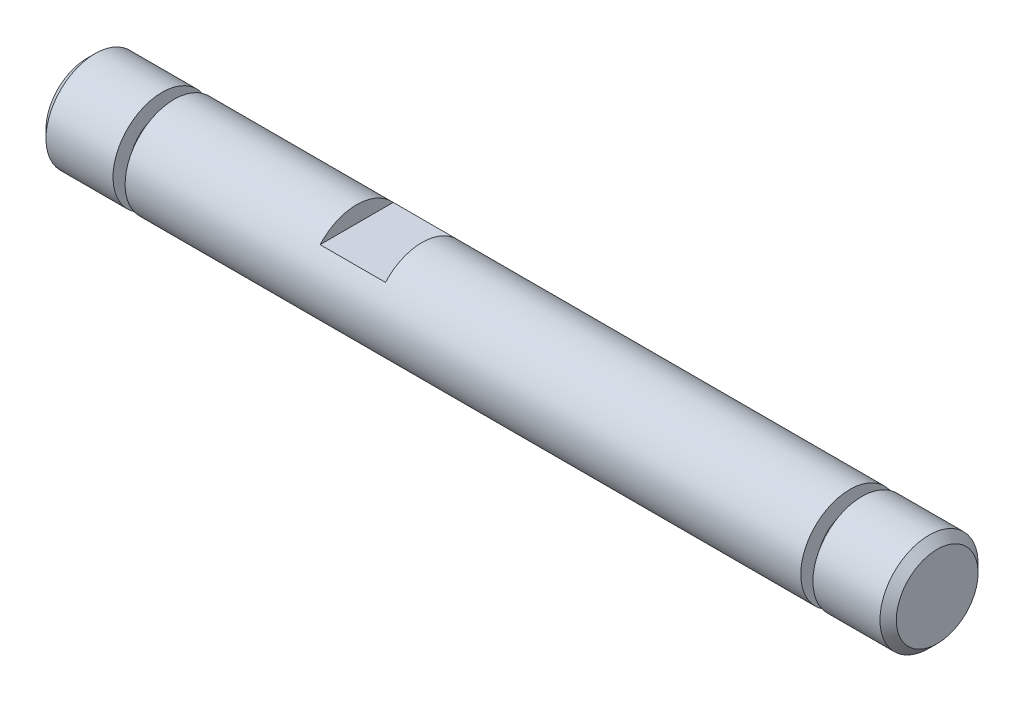
ISO-10303-21;
HEADER;
FILE_DESCRIPTION(('STEP AP214'),'2;1');
FILE_NAME('part.step','',(''),(''),'','','');
FILE_SCHEMA(('AUTOMOTIVE_DESIGN { 1 0 10303 214 1 1 1 1 }'));
ENDSEC;
DATA;
#1=APPLICATION_CONTEXT('core data for automotive mechanical design processes');
#2=APPLICATION_PROTOCOL_DEFINITION('international standard','automotive_design',2000,#1);
#3=PRODUCT_CONTEXT('',#1,'mechanical');
#4=PRODUCT('Part','Part','',(#3));
#5=PRODUCT_RELATED_PRODUCT_CATEGORY('part','',(#4));
#6=PRODUCT_DEFINITION_FORMATION('','',#4);
#7=PRODUCT_DEFINITION_CONTEXT('part definition',#1,'design');
#8=PRODUCT_DEFINITION('design','',#6,#7);
#9=PRODUCT_DEFINITION_SHAPE('','',#8);
#10=(LENGTH_UNIT() NAMED_UNIT(*) SI_UNIT(.MILLI.,.METRE.));
#11=(NAMED_UNIT(*) PLANE_ANGLE_UNIT() SI_UNIT($,.RADIAN.));
#12=(NAMED_UNIT(*) SI_UNIT($,.STERADIAN.) SOLID_ANGLE_UNIT());
#13=UNCERTAINTY_MEASURE_WITH_UNIT(LENGTH_MEASURE(1.E-05),#10,'distance_accuracy_value','');
#14=(GEOMETRIC_REPRESENTATION_CONTEXT(3) GLOBAL_UNCERTAINTY_ASSIGNED_CONTEXT((#13)) GLOBAL_UNIT_ASSIGNED_CONTEXT((#10,
#11,#12)) REPRESENTATION_CONTEXT('',''));
#15=CARTESIAN_POINT('',(0.,0.,0.));
#16=DIRECTION('',(0.,0.,1.));
#17=DIRECTION('',(1.,0.,0.));
#18=AXIS2_PLACEMENT_3D('',#15,#16,#17);
#19=CARTESIAN_POINT('',(0.,0.,0.));
#20=DIRECTION('',(-1.,0.,0.));
#21=DIRECTION('',(0.,0.,1.));
#22=AXIS2_PLACEMENT_3D('',#19,#20,#21);
#23=CYLINDRICAL_SURFACE('',#22,3.);
#24=CARTESIAN_POINT('',(20.66,0.,0.));
#25=DIRECTION('',(1.,0.,0.));
#26=DIRECTION('',(0.,1.,0.));
#27=AXIS2_PLACEMENT_3D('',#24,#25,#26);
#28=CIRCLE('',#27,3.);
#29=CARTESIAN_POINT('',(20.66,3.,0.));
#30=VERTEX_POINT('',#29);
#31=EDGE_CURVE('E98',#30,#30,#28,.T.);
#32=ORIENTED_EDGE('',*,*,#31,.F.);
#33=EDGE_LOOP('',(#32));
#34=FACE_BOUND('',#33,.T.);
#35=CARTESIAN_POINT('',(-5.49999999999999,0.,0.));
#36=DIRECTION('',(-1.,0.,0.));
#37=DIRECTION('',(0.,-1.,0.));
#38=AXIS2_PLACEMENT_3D('',#35,#36,#37);
#39=CIRCLE('',#38,3.);
#40=CARTESIAN_POINT('',(-5.5,2.00000000000001,2.23606797749978));
#41=VERTEX_POINT('',#40);
#42=CARTESIAN_POINT('',(-5.5,2.00000000000001,-2.23606797749978));
#43=VERTEX_POINT('',#42);
#44=EDGE_CURVE('E65',#41,#43,#39,.T.);
#45=ORIENTED_EDGE('',*,*,#44,.F.);
#46=DIRECTION('',(-1.,0.,0.));
#47=VECTOR('',#46,1.);
#48=CARTESIAN_POINT('',(0.,2.00000000000001,2.23606797749978));
#49=LINE('',#48,#47);
#50=CARTESIAN_POINT('',(-9.5,2.00000000000001,2.23606797749978));
#51=VERTEX_POINT('',#50);
#52=EDGE_CURVE('E11',#41,#51,#49,.T.);
#53=ORIENTED_EDGE('',*,*,#52,.T.);
#54=CARTESIAN_POINT('',(-9.5,0.,0.));
#55=DIRECTION('',(-1.,0.,0.));
#56=DIRECTION('',(0.,0.,1.));
#57=AXIS2_PLACEMENT_3D('',#54,#55,#56);
#58=CIRCLE('',#57,3.);
#59=CARTESIAN_POINT('',(-9.5,2.00000000000001,-2.23606797749978));
#60=VERTEX_POINT('',#59);
#61=EDGE_CURVE('E41',#51,#60,#58,.T.);
#62=ORIENTED_EDGE('',*,*,#61,.T.);
#63=DIRECTION('',(-1.,0.,0.));
#64=VECTOR('',#63,1.);
#65=CARTESIAN_POINT('',(0.,2.00000000000001,-2.23606797749978));
#66=LINE('',#65,#64);
#67=EDGE_CURVE('E70',#60,#43,#66,.F.);
#68=ORIENTED_EDGE('',*,*,#67,.T.);
#69=EDGE_LOOP('',(#45,#53,#62,#68));
#70=FACE_BOUND('',#69,.T.);
#71=CARTESIAN_POINT('',(-20.66,0.,0.));
#72=DIRECTION('',(1.,0.,0.));
#73=DIRECTION('',(0.,1.,0.));
#74=AXIS2_PLACEMENT_3D('',#71,#72,#73);
#75=CIRCLE('',#74,3.);
#76=CARTESIAN_POINT('',(-20.66,3.,0.));
#77=VERTEX_POINT('',#76);
#78=EDGE_CURVE('E92',#77,#77,#75,.T.);
#79=ORIENTED_EDGE('',*,*,#78,.T.);
#80=EDGE_LOOP('',(#79));
#81=FACE_BOUND('',#80,.T.);
#82=ADVANCED_FACE('F33',(#34,#70,#81),#23,.T.);
#83=CARTESIAN_POINT('',(-21.4,0.,0.));
#84=DIRECTION('',(1.,0.,0.));
#85=DIRECTION('',(0.,1.,0.));
#86=AXIS2_PLACEMENT_3D('',#83,#84,#85);
#87=CIRCLE('',#86,3.);
#88=CARTESIAN_POINT('',(-21.4,3.,0.));
#89=VERTEX_POINT('',#88);
#90=EDGE_CURVE('E95',#89,#89,#87,.T.);
#91=ORIENTED_EDGE('',*,*,#90,.F.);
#92=EDGE_LOOP('',(#91));
#93=FACE_BOUND('',#92,.T.);
#94=CARTESIAN_POINT('',(-25.5,0.,0.));
#95=DIRECTION('',(1.,0.,0.));
#96=DIRECTION('',(0.,0.,-1.));
#97=AXIS2_PLACEMENT_3D('',#94,#95,#96);
#98=CIRCLE('',#97,3.);
#99=CARTESIAN_POINT('',(-25.5,0.,-3.));
#100=VERTEX_POINT('',#99);
#101=EDGE_CURVE('E77',#100,#100,#98,.T.);
#102=ORIENTED_EDGE('',*,*,#101,.T.);
#103=EDGE_LOOP('',(#102));
#104=FACE_BOUND('',#103,.T.);
#105=ADVANCED_FACE('F134',(#93,#104),#23,.T.);
#106=CARTESIAN_POINT('',(-26.,0.,0.));
#107=DIRECTION('',(1.,0.,0.));
#108=DIRECTION('',(0.,0.,-1.));
#109=AXIS2_PLACEMENT_3D('',#106,#107,#108);
#110=PLANE('',#109);
#111=CARTESIAN_POINT('',(-26.,0.,0.));
#112=DIRECTION('',(1.,0.,0.));
#113=DIRECTION('',(0.,0.,-1.));
#114=AXIS2_PLACEMENT_3D('',#111,#112,#113);
#115=CIRCLE('',#114,2.49999999999999);
#116=CARTESIAN_POINT('',(-26.,0.,-2.49999999999999));
#117=VERTEX_POINT('',#116);
#118=EDGE_CURVE('E67',#117,#117,#115,.F.);
#119=ORIENTED_EDGE('',*,*,#118,.T.);
#120=EDGE_LOOP('',(#119));
#121=FACE_BOUND('',#120,.T.);
#122=ADVANCED_FACE('F139',(#121),#110,.F.);
#123=CARTESIAN_POINT('',(-26.,0.,0.));
#124=DIRECTION('',(1.,0.,0.));
#125=DIRECTION('',(0.,0.,-1.));
#126=AXIS2_PLACEMENT_3D('',#123,#124,#125);
#127=CONICAL_SURFACE('',#126,2.49999999999999,0.785398163397446);
#128=ORIENTED_EDGE('',*,*,#101,.F.);
#129=EDGE_LOOP('',(#128));
#130=FACE_BOUND('',#129,.T.);
#131=ORIENTED_EDGE('',*,*,#118,.F.);
#132=EDGE_LOOP('',(#131));
#133=FACE_BOUND('',#132,.T.);
#134=ADVANCED_FACE('F170',(#130,#133),#127,.T.);
#135=CARTESIAN_POINT('',(-21.4,3.,0.));
#136=DIRECTION('',(-1.,0.,0.));
#137=DIRECTION('',(0.,-1.,0.));
#138=AXIS2_PLACEMENT_3D('',#135,#136,#137);
#139=PLANE('',#138);
#140=CARTESIAN_POINT('',(-21.4,0.,0.));
#141=DIRECTION('',(1.,0.,0.));
#142=DIRECTION('',(0.,1.,0.));
#143=AXIS2_PLACEMENT_3D('',#140,#141,#142);
#144=CIRCLE('',#143,2.);
#145=CARTESIAN_POINT('',(-21.4,2.,0.));
#146=VERTEX_POINT('',#145);
#147=EDGE_CURVE('E85',#146,#146,#144,.T.);
#148=ORIENTED_EDGE('',*,*,#147,.F.);
#149=EDGE_LOOP('',(#148));
#150=FACE_BOUND('',#149,.T.);
#151=ORIENTED_EDGE('',*,*,#90,.T.);
#152=EDGE_LOOP('',(#151));
#153=FACE_BOUND('',#152,.T.);
#154=ADVANCED_FACE('F166',(#150,#153),#139,.F.);
#155=CARTESIAN_POINT('',(0.,0.,0.));
#156=DIRECTION('',(1.,0.,0.));
#157=DIRECTION('',(0.,1.,0.));
#158=AXIS2_PLACEMENT_3D('',#155,#156,#157);
#159=CYLINDRICAL_SURFACE('',#158,2.);
#160=CARTESIAN_POINT('',(-20.66,0.,0.));
#161=DIRECTION('',(1.,0.,0.));
#162=DIRECTION('',(0.,1.,0.));
#163=AXIS2_PLACEMENT_3D('',#160,#161,#162);
#164=CIRCLE('',#163,2.);
#165=CARTESIAN_POINT('',(-20.66,2.,0.));
#166=VERTEX_POINT('',#165);
#167=EDGE_CURVE('E89',#166,#166,#164,.T.);
#168=ORIENTED_EDGE('',*,*,#167,.F.);
#169=EDGE_LOOP('',(#168));
#170=FACE_BOUND('',#169,.T.);
#171=ORIENTED_EDGE('',*,*,#147,.T.);
#172=EDGE_LOOP('',(#171));
#173=FACE_BOUND('',#172,.T.);
#174=ADVANCED_FACE('F169',(#170,#173),#159,.T.);
#175=CARTESIAN_POINT('',(-20.66,3.,0.));
#176=DIRECTION('',(1.,0.,0.));
#177=DIRECTION('',(0.,1.,0.));
#178=AXIS2_PLACEMENT_3D('',#175,#176,#177);
#179=PLANE('',#178);
#180=ORIENTED_EDGE('',*,*,#78,.F.);
#181=EDGE_LOOP('',(#180));
#182=FACE_BOUND('',#181,.T.);
#183=ORIENTED_EDGE('',*,*,#167,.T.);
#184=EDGE_LOOP('',(#183));
#185=FACE_BOUND('',#184,.T.);
#186=ADVANCED_FACE('F161',(#182,#185),#179,.F.);
#187=CARTESIAN_POINT('',(-9.5,4.00000000000001,-3.));
#188=DIRECTION('',(-1.,0.,0.));
#189=DIRECTION('',(0.,0.,1.));
#190=AXIS2_PLACEMENT_3D('',#187,#188,#189);
#191=PLANE('',#190);
#192=DIRECTION('',(0.,0.,1.));
#193=VECTOR('',#192,1.);
#194=CARTESIAN_POINT('',(-9.5,2.00000000000001,-3.));
#195=LINE('',#194,#193);
#196=EDGE_CURVE('E60',#60,#51,#195,.T.);
#197=ORIENTED_EDGE('',*,*,#196,.F.);
#198=ORIENTED_EDGE('',*,*,#61,.F.);
#199=EDGE_LOOP('',(#197,#198));
#200=FACE_BOUND('',#199,.T.);
#201=ADVANCED_FACE('F158',(#200),#191,.F.);
#202=CARTESIAN_POINT('',(-9.5,2.00000000000001,-3.));
#203=DIRECTION('',(0.,-1.,0.));
#204=DIRECTION('',(0.,0.,-1.));
#205=AXIS2_PLACEMENT_3D('',#202,#203,#204);
#206=PLANE('',#205);
#207=DIRECTION('',(0.,0.,1.));
#208=VECTOR('',#207,1.);
#209=CARTESIAN_POINT('',(-5.5,2.00000000000001,-3.));
#210=LINE('',#209,#208);
#211=EDGE_CURVE('E48',#43,#41,#210,.T.);
#212=ORIENTED_EDGE('',*,*,#211,.F.);
#213=ORIENTED_EDGE('',*,*,#67,.F.);
#214=ORIENTED_EDGE('',*,*,#196,.T.);
#215=ORIENTED_EDGE('',*,*,#52,.F.);
#216=EDGE_LOOP('',(#212,#213,#214,#215));
#217=FACE_BOUND('',#216,.T.);
#218=ADVANCED_FACE('F59',(#217),#206,.F.);
#219=CARTESIAN_POINT('',(-5.5,4.00000000000001,-3.));
#220=DIRECTION('',(-1.,0.,0.));
#221=DIRECTION('',(0.,-1.,0.));
#222=AXIS2_PLACEMENT_3D('',#219,#220,#221);
#223=PLANE('',#222);
#224=ORIENTED_EDGE('',*,*,#44,.T.);
#225=ORIENTED_EDGE('',*,*,#211,.T.);
#226=EDGE_LOOP('',(#224,#225));
#227=FACE_BOUND('',#226,.T.);
#228=ADVANCED_FACE('F64',(#227),#223,.T.);
#229=CARTESIAN_POINT('',(20.66,3.,0.));
#230=DIRECTION('',(-1.,0.,0.));
#231=DIRECTION('',(0.,-1.,0.));
#232=AXIS2_PLACEMENT_3D('',#229,#230,#231);
#233=PLANE('',#232);
#234=CARTESIAN_POINT('',(20.66,0.,0.));
#235=DIRECTION('',(1.,0.,0.));
#236=DIRECTION('',(0.,1.,0.));
#237=AXIS2_PLACEMENT_3D('',#234,#235,#236);
#238=CIRCLE('',#237,1.99999999999999);
#239=CARTESIAN_POINT('',(20.66,2.,0.));
#240=VERTEX_POINT('',#239);
#241=EDGE_CURVE('E101',#240,#240,#238,.T.);
#242=ORIENTED_EDGE('',*,*,#241,.F.);
#243=EDGE_LOOP('',(#242));
#244=FACE_BOUND('',#243,.T.);
#245=ORIENTED_EDGE('',*,*,#31,.T.);
#246=EDGE_LOOP('',(#245));
#247=FACE_BOUND('',#246,.T.);
#248=ADVANCED_FACE('F124',(#244,#247),#233,.F.);
#249=CARTESIAN_POINT('',(0.,0.,0.));
#250=DIRECTION('',(1.,0.,0.));
#251=DIRECTION('',(0.,1.,0.));
#252=AXIS2_PLACEMENT_3D('',#249,#250,#251);
#253=CYLINDRICAL_SURFACE('',#252,1.99999999999999);
#254=CARTESIAN_POINT('',(21.4,0.,0.));
#255=DIRECTION('',(1.,0.,0.));
#256=DIRECTION('',(0.,1.,0.));
#257=AXIS2_PLACEMENT_3D('',#254,#255,#256);
#258=CIRCLE('',#257,1.99999999999999);
#259=CARTESIAN_POINT('',(21.4,2.,0.));
#260=VERTEX_POINT('',#259);
#261=EDGE_CURVE('E104',#260,#260,#258,.T.);
#262=ORIENTED_EDGE('',*,*,#261,.F.);
#263=EDGE_LOOP('',(#262));
#264=FACE_BOUND('',#263,.T.);
#265=ORIENTED_EDGE('',*,*,#241,.T.);
#266=EDGE_LOOP('',(#265));
#267=FACE_BOUND('',#266,.T.);
#268=ADVANCED_FACE('F118',(#264,#267),#253,.T.);
#269=CARTESIAN_POINT('',(21.4,3.,0.));
#270=DIRECTION('',(1.,0.,0.));
#271=DIRECTION('',(0.,1.,0.));
#272=AXIS2_PLACEMENT_3D('',#269,#270,#271);
#273=PLANE('',#272);
#274=CARTESIAN_POINT('',(21.4,0.,0.));
#275=DIRECTION('',(1.,0.,0.));
#276=DIRECTION('',(0.,1.,0.));
#277=AXIS2_PLACEMENT_3D('',#274,#275,#276);
#278=CIRCLE('',#277,3.);
#279=CARTESIAN_POINT('',(21.4,3.,0.));
#280=VERTEX_POINT('',#279);
#281=EDGE_CURVE('E107',#280,#280,#278,.T.);
#282=ORIENTED_EDGE('',*,*,#281,.F.);
#283=EDGE_LOOP('',(#282));
#284=FACE_BOUND('',#283,.T.);
#285=ORIENTED_EDGE('',*,*,#261,.T.);
#286=EDGE_LOOP('',(#285));
#287=FACE_BOUND('',#286,.T.);
#288=ADVANCED_FACE('F114',(#284,#287),#273,.F.);
#289=CARTESIAN_POINT('',(26.,0.,0.));
#290=DIRECTION('',(-1.,0.,0.));
#291=DIRECTION('',(0.,0.,1.));
#292=AXIS2_PLACEMENT_3D('',#289,#290,#291);
#293=PLANE('',#292);
#294=CARTESIAN_POINT('',(26.,0.,0.));
#295=DIRECTION('',(-1.,0.,0.));
#296=DIRECTION('',(0.,0.,1.));
#297=AXIS2_PLACEMENT_3D('',#294,#295,#296);
#298=CIRCLE('',#297,2.50000000000002);
#299=CARTESIAN_POINT('',(26.,0.,2.50000000000002));
#300=VERTEX_POINT('',#299);
#301=EDGE_CURVE('E72',#300,#300,#298,.F.);
#302=ORIENTED_EDGE('',*,*,#301,.T.);
#303=EDGE_LOOP('',(#302));
#304=FACE_BOUND('',#303,.T.);
#305=ADVANCED_FACE('F117',(#304),#293,.F.);
#306=CARTESIAN_POINT('',(25.5,0.,0.));
#307=DIRECTION('',(-1.,0.,0.));
#308=DIRECTION('',(0.,0.,1.));
#309=AXIS2_PLACEMENT_3D('',#306,#307,#308);
#310=CONICAL_SURFACE('',#309,3.,0.785398163397453);
#311=ORIENTED_EDGE('',*,*,#301,.F.);
#312=EDGE_LOOP('',(#311));
#313=FACE_BOUND('',#312,.T.);
#314=CARTESIAN_POINT('',(25.5,0.,0.));
#315=DIRECTION('',(-1.,0.,0.));
#316=DIRECTION('',(0.,0.,1.));
#317=AXIS2_PLACEMENT_3D('',#314,#315,#316);
#318=CIRCLE('',#317,3.);
#319=CARTESIAN_POINT('',(25.5,0.,3.));
#320=VERTEX_POINT('',#319);
#321=EDGE_CURVE('E80',#320,#320,#318,.T.);
#322=ORIENTED_EDGE('',*,*,#321,.F.);
#323=EDGE_LOOP('',(#322));
#324=FACE_BOUND('',#323,.T.);
#325=ADVANCED_FACE('F35',(#313,#324),#310,.T.);
#326=ORIENTED_EDGE('',*,*,#281,.T.);
#327=EDGE_LOOP('',(#326));
#328=FACE_BOUND('',#327,.T.);
#329=ORIENTED_EDGE('',*,*,#321,.T.);
#330=EDGE_LOOP('',(#329));
#331=FACE_BOUND('',#330,.T.);
#332=ADVANCED_FACE('F111',(#328,#331),#23,.T.);
#333=CLOSED_SHELL('',(#82,#105,#122,#134,#154,#174,#186,#201,#218,#228,#248,#268,#288,#305,#325,#332));
#334=MANIFOLD_SOLID_BREP('B2',#333);
#335=ADVANCED_BREP_SHAPE_REPRESENTATION('',(#18,#334),#14);
#336=SHAPE_DEFINITION_REPRESENTATION(#9,#335);
ENDSEC;
END-ISO-10303-21;
